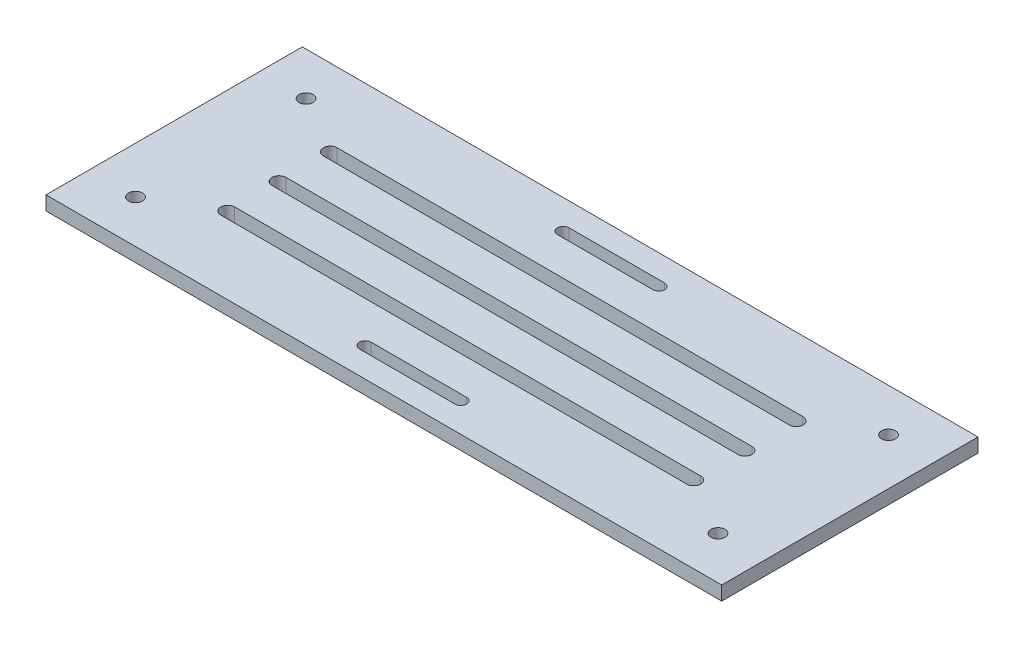
ISO-10303-21;
HEADER;
FILE_DESCRIPTION(('STEP AP214'),'2;1');
FILE_NAME('part.step','',(''),(''),'','','');
FILE_SCHEMA(('AUTOMOTIVE_DESIGN { 1 0 10303 214 1 1 1 1 }'));
ENDSEC;
DATA;
#1=APPLICATION_CONTEXT('core data for automotive mechanical design processes');
#2=APPLICATION_PROTOCOL_DEFINITION('international standard','automotive_design',2000,#1);
#3=PRODUCT_CONTEXT('',#1,'mechanical');
#4=PRODUCT('Part','Part','',(#3));
#5=PRODUCT_RELATED_PRODUCT_CATEGORY('part','',(#4));
#6=PRODUCT_DEFINITION_FORMATION('','',#4);
#7=PRODUCT_DEFINITION_CONTEXT('part definition',#1,'design');
#8=PRODUCT_DEFINITION('design','',#6,#7);
#9=PRODUCT_DEFINITION_SHAPE('','',#8);
#10=(LENGTH_UNIT() NAMED_UNIT(*) SI_UNIT(.MILLI.,.METRE.));
#11=(NAMED_UNIT(*) PLANE_ANGLE_UNIT() SI_UNIT($,.RADIAN.));
#12=(NAMED_UNIT(*) SI_UNIT($,.STERADIAN.) SOLID_ANGLE_UNIT());
#13=UNCERTAINTY_MEASURE_WITH_UNIT(LENGTH_MEASURE(1.E-05),#10,'distance_accuracy_value','');
#14=(GEOMETRIC_REPRESENTATION_CONTEXT(3) GLOBAL_UNCERTAINTY_ASSIGNED_CONTEXT((#13)) GLOBAL_UNIT_ASSIGNED_CONTEXT((#10,
#11,#12)) REPRESENTATION_CONTEXT('',''));
#15=CARTESIAN_POINT('',(0.,0.,0.));
#16=DIRECTION('',(0.,0.,1.));
#17=DIRECTION('',(1.,0.,0.));
#18=AXIS2_PLACEMENT_3D('',#15,#16,#17);
#19=CARTESIAN_POINT('',(72.5,3.,27.5));
#20=DIRECTION('',(-1.,0.,0.));
#21=DIRECTION('',(0.,0.,1.));
#22=AXIS2_PLACEMENT_3D('',#19,#20,#21);
#23=PLANE('',#22);
#24=DIRECTION('',(0.,0.,-1.));
#25=VECTOR('',#24,1.);
#26=CARTESIAN_POINT('',(72.5,0.,27.5));
#27=LINE('',#26,#25);
#28=CARTESIAN_POINT('',(72.5,0.,27.5));
#29=VERTEX_POINT('',#28);
#30=CARTESIAN_POINT('',(72.5,0.,-27.5));
#31=VERTEX_POINT('',#30);
#32=EDGE_CURVE('E383',#29,#31,#27,.T.);
#33=ORIENTED_EDGE('',*,*,#32,.T.);
#34=DIRECTION('',(0.,-1.,0.));
#35=VECTOR('',#34,1.);
#36=CARTESIAN_POINT('',(72.5,3.,-27.5));
#37=LINE('',#36,#35);
#38=CARTESIAN_POINT('',(72.5,3.,-27.5));
#39=VERTEX_POINT('',#38);
#40=EDGE_CURVE('E11',#39,#31,#37,.T.);
#41=ORIENTED_EDGE('',*,*,#40,.F.);
#42=DIRECTION('',(0.,0.,-1.));
#43=VECTOR('',#42,1.);
#44=CARTESIAN_POINT('',(72.5,3.,27.5));
#45=LINE('',#44,#43);
#46=CARTESIAN_POINT('',(72.5,3.,27.5));
#47=VERTEX_POINT('',#46);
#48=EDGE_CURVE('E390',#47,#39,#45,.T.);
#49=ORIENTED_EDGE('',*,*,#48,.F.);
#50=DIRECTION('',(0.,-1.,0.));
#51=VECTOR('',#50,1.);
#52=CARTESIAN_POINT('',(72.5,3.,27.5));
#53=LINE('',#52,#51);
#54=EDGE_CURVE('E400',#47,#29,#53,.T.);
#55=ORIENTED_EDGE('',*,*,#54,.T.);
#56=EDGE_LOOP('',(#33,#41,#49,#55));
#57=FACE_BOUND('',#56,.T.);
#58=ADVANCED_FACE('F39',(#57),#23,.F.);
#59=CARTESIAN_POINT('',(-72.5,3.,-27.5));
#60=DIRECTION('',(0.,0.,1.));
#61=DIRECTION('',(1.,0.,0.));
#62=AXIS2_PLACEMENT_3D('',#59,#60,#61);
#63=PLANE('',#62);
#64=DIRECTION('',(-1.,0.,0.));
#65=VECTOR('',#64,1.);
#66=CARTESIAN_POINT('',(-72.5,0.,-27.5));
#67=LINE('',#66,#65);
#68=CARTESIAN_POINT('',(-72.5,0.,-27.5));
#69=VERTEX_POINT('',#68);
#70=EDGE_CURVE('E397',#31,#69,#67,.T.);
#71=ORIENTED_EDGE('',*,*,#70,.T.);
#72=DIRECTION('',(0.,-1.,0.));
#73=VECTOR('',#72,1.);
#74=CARTESIAN_POINT('',(-72.5,3.,-27.5));
#75=LINE('',#74,#73);
#76=CARTESIAN_POINT('',(-72.5,3.,-27.5));
#77=VERTEX_POINT('',#76);
#78=EDGE_CURVE('E46',#77,#69,#75,.T.);
#79=ORIENTED_EDGE('',*,*,#78,.F.);
#80=DIRECTION('',(-1.,0.,0.));
#81=VECTOR('',#80,1.);
#82=CARTESIAN_POINT('',(-72.5,3.,-27.5));
#83=LINE('',#82,#81);
#84=EDGE_CURVE('E388',#39,#77,#83,.T.);
#85=ORIENTED_EDGE('',*,*,#84,.F.);
#86=ORIENTED_EDGE('',*,*,#40,.T.);
#87=EDGE_LOOP('',(#71,#79,#85,#86));
#88=FACE_BOUND('',#87,.T.);
#89=ADVANCED_FACE('F427',(#88),#63,.F.);
#90=CARTESIAN_POINT('',(-72.5,3.,27.5));
#91=DIRECTION('',(1.,0.,0.));
#92=DIRECTION('',(0.,0.,-1.));
#93=AXIS2_PLACEMENT_3D('',#90,#91,#92);
#94=PLANE('',#93);
#95=DIRECTION('',(0.,0.,1.));
#96=VECTOR('',#95,1.);
#97=CARTESIAN_POINT('',(-72.5,0.,27.5));
#98=LINE('',#97,#96);
#99=CARTESIAN_POINT('',(-72.5,0.,27.5));
#100=VERTEX_POINT('',#99);
#101=EDGE_CURVE('E405',#69,#100,#98,.T.);
#102=ORIENTED_EDGE('',*,*,#101,.T.);
#103=DIRECTION('',(0.,-1.,0.));
#104=VECTOR('',#103,1.);
#105=CARTESIAN_POINT('',(-72.5,3.,27.5));
#106=LINE('',#105,#104);
#107=CARTESIAN_POINT('',(-72.5,3.,27.5));
#108=VERTEX_POINT('',#107);
#109=EDGE_CURVE('E410',#108,#100,#106,.T.);
#110=ORIENTED_EDGE('',*,*,#109,.F.);
#111=DIRECTION('',(0.,0.,1.));
#112=VECTOR('',#111,1.);
#113=CARTESIAN_POINT('',(-72.5,3.,27.5));
#114=LINE('',#113,#112);
#115=EDGE_CURVE('E394',#77,#108,#114,.T.);
#116=ORIENTED_EDGE('',*,*,#115,.F.);
#117=ORIENTED_EDGE('',*,*,#78,.T.);
#118=EDGE_LOOP('',(#102,#110,#116,#117));
#119=FACE_BOUND('',#118,.T.);
#120=ADVANCED_FACE('F414',(#119),#94,.F.);
#121=CARTESIAN_POINT('',(-72.5,3.,27.5));
#122=DIRECTION('',(0.,0.,-1.));
#123=DIRECTION('',(-1.,0.,0.));
#124=AXIS2_PLACEMENT_3D('',#121,#122,#123);
#125=PLANE('',#124);
#126=DIRECTION('',(1.,0.,0.));
#127=VECTOR('',#126,1.);
#128=CARTESIAN_POINT('',(-72.5,0.,27.5));
#129=LINE('',#128,#127);
#130=EDGE_CURVE('E392',#100,#29,#129,.T.);
#131=ORIENTED_EDGE('',*,*,#130,.T.);
#132=ORIENTED_EDGE('',*,*,#54,.F.);
#133=DIRECTION('',(1.,0.,0.));
#134=VECTOR('',#133,1.);
#135=CARTESIAN_POINT('',(-72.5,3.,27.5));
#136=LINE('',#135,#134);
#137=EDGE_CURVE('E393',#108,#47,#136,.T.);
#138=ORIENTED_EDGE('',*,*,#137,.F.);
#139=ORIENTED_EDGE('',*,*,#109,.T.);
#140=EDGE_LOOP('',(#131,#132,#138,#139));
#141=FACE_BOUND('',#140,.T.);
#142=ADVANCED_FACE('F421',(#141),#125,.F.);
#143=CARTESIAN_POINT('',(0.,3.,0.));
#144=DIRECTION('',(0.,-1.,0.));
#145=DIRECTION('',(0.,0.,-1.));
#146=AXIS2_PLACEMENT_3D('',#143,#144,#145);
#147=PLANE('',#146);
#148=CARTESIAN_POINT('',(-62.5,3.,18.3));
#149=DIRECTION('',(0.,1.,0.));
#150=DIRECTION('',(0.,0.,-1.));
#151=AXIS2_PLACEMENT_3D('',#148,#149,#150);
#152=CIRCLE('',#151,1.5);
#153=CARTESIAN_POINT('',(-62.5,3.,16.8));
#154=VERTEX_POINT('',#153);
#155=EDGE_CURVE('E334',#154,#154,#152,.T.);
#156=ORIENTED_EDGE('',*,*,#155,.F.);
#157=EDGE_LOOP('',(#156));
#158=FACE_BOUND('',#157,.T.);
#159=CARTESIAN_POINT('',(62.5,3.,18.3000000000001));
#160=DIRECTION('',(0.,1.,0.));
#161=DIRECTION('',(0.,0.,1.));
#162=AXIS2_PLACEMENT_3D('',#159,#160,#161);
#163=CIRCLE('',#162,1.5);
#164=CARTESIAN_POINT('',(62.5,3.,19.8000000000001));
#165=VERTEX_POINT('',#164);
#166=EDGE_CURVE('E338',#165,#165,#163,.T.);
#167=ORIENTED_EDGE('',*,*,#166,.F.);
#168=EDGE_LOOP('',(#167));
#169=FACE_BOUND('',#168,.T.);
#170=CARTESIAN_POINT('',(62.5,3.,-18.2999999999999));
#171=DIRECTION('',(0.,1.,0.));
#172=DIRECTION('',(0.,0.,-1.));
#173=AXIS2_PLACEMENT_3D('',#170,#171,#172);
#174=CIRCLE('',#173,1.5);
#175=CARTESIAN_POINT('',(62.5,3.,-19.7999999999999));
#176=VERTEX_POINT('',#175);
#177=EDGE_CURVE('E347',#176,#176,#174,.T.);
#178=ORIENTED_EDGE('',*,*,#177,.F.);
#179=EDGE_LOOP('',(#178));
#180=FACE_BOUND('',#179,.T.);
#181=DIRECTION('',(1.,0.,0.));
#182=VECTOR('',#181,1.);
#183=CARTESIAN_POINT('',(-10.25,3.,-20.));
#184=LINE('',#183,#182);
#185=CARTESIAN_POINT('',(-10.25,3.,-20.));
#186=VERTEX_POINT('',#185);
#187=CARTESIAN_POINT('',(10.25,3.,-20.));
#188=VERTEX_POINT('',#187);
#189=EDGE_CURVE('E370',#186,#188,#184,.T.);
#190=ORIENTED_EDGE('',*,*,#189,.F.);
#191=CARTESIAN_POINT('',(-10.25,3.,-21.25));
#192=DIRECTION('',(0.,1.,0.));
#193=DIRECTION('',(0.,0.,1.));
#194=AXIS2_PLACEMENT_3D('',#191,#192,#193);
#195=CIRCLE('',#194,1.25);
#196=CARTESIAN_POINT('',(-10.25,3.,-22.5));
#197=VERTEX_POINT('',#196);
#198=EDGE_CURVE('E52',#197,#186,#195,.T.);
#199=ORIENTED_EDGE('',*,*,#198,.F.);
#200=DIRECTION('',(-1.,0.,0.));
#201=VECTOR('',#200,1.);
#202=CARTESIAN_POINT('',(-10.25,3.,-22.5));
#203=LINE('',#202,#201);
#204=CARTESIAN_POINT('',(10.25,3.,-22.5));
#205=VERTEX_POINT('',#204);
#206=EDGE_CURVE('E357',#205,#197,#203,.T.);
#207=ORIENTED_EDGE('',*,*,#206,.F.);
#208=CARTESIAN_POINT('',(10.25,3.,-21.25));
#209=DIRECTION('',(0.,1.,0.));
#210=DIRECTION('',(0.,0.,1.));
#211=AXIS2_PLACEMENT_3D('',#208,#209,#210);
#212=CIRCLE('',#211,1.25);
#213=EDGE_CURVE('E361',#188,#205,#212,.T.);
#214=ORIENTED_EDGE('',*,*,#213,.F.);
#215=EDGE_LOOP('',(#190,#199,#207,#214));
#216=FACE_BOUND('',#215,.T.);
#217=DIRECTION('',(1.,0.,0.));
#218=VECTOR('',#217,1.);
#219=CARTESIAN_POINT('',(-50.,3.,1.5));
#220=LINE('',#219,#218);
#221=CARTESIAN_POINT('',(-50.,3.,1.5));
#222=VERTEX_POINT('',#221);
#223=CARTESIAN_POINT('',(50.,3.,1.49999999999998));
#224=VERTEX_POINT('',#223);
#225=EDGE_CURVE('E260',#222,#224,#220,.T.);
#226=ORIENTED_EDGE('',*,*,#225,.F.);
#227=CARTESIAN_POINT('',(-50.,3.,0.));
#228=DIRECTION('',(0.,1.,0.));
#229=DIRECTION('',(0.,0.,1.));
#230=AXIS2_PLACEMENT_3D('',#227,#228,#229);
#231=CIRCLE('',#230,1.5);
#232=CARTESIAN_POINT('',(-50.,3.,-1.5));
#233=VERTEX_POINT('',#232);
#234=EDGE_CURVE('E62',#233,#222,#231,.T.);
#235=ORIENTED_EDGE('',*,*,#234,.F.);
#236=DIRECTION('',(-1.,0.,0.));
#237=VECTOR('',#236,1.);
#238=CARTESIAN_POINT('',(-50.,3.,-1.5));
#239=LINE('',#238,#237);
#240=CARTESIAN_POINT('',(50.,3.,-1.50000000000002));
#241=VERTEX_POINT('',#240);
#242=EDGE_CURVE('E247',#241,#233,#239,.T.);
#243=ORIENTED_EDGE('',*,*,#242,.F.);
#244=CARTESIAN_POINT('',(50.,3.,0.));
#245=DIRECTION('',(0.,1.,0.));
#246=DIRECTION('',(0.,0.,1.));
#247=AXIS2_PLACEMENT_3D('',#244,#245,#246);
#248=CIRCLE('',#247,1.5);
#249=EDGE_CURVE('E251',#224,#241,#248,.T.);
#250=ORIENTED_EDGE('',*,*,#249,.F.);
#251=EDGE_LOOP('',(#226,#235,#243,#250));
#252=FACE_BOUND('',#251,.T.);
#253=DIRECTION('',(1.,0.,0.));
#254=VECTOR('',#253,1.);
#255=CARTESIAN_POINT('',(-50.,3.,12.5));
#256=LINE('',#255,#254);
#257=CARTESIAN_POINT('',(-50.,3.,12.5));
#258=VERTEX_POINT('',#257);
#259=CARTESIAN_POINT('',(50.,3.,12.5));
#260=VERTEX_POINT('',#259);
#261=EDGE_CURVE('E224',#258,#260,#256,.T.);
#262=ORIENTED_EDGE('',*,*,#261,.F.);
#263=CARTESIAN_POINT('',(-50.,3.,11.));
#264=DIRECTION('',(0.,1.,0.));
#265=DIRECTION('',(0.,0.,-1.));
#266=AXIS2_PLACEMENT_3D('',#263,#264,#265);
#267=CIRCLE('',#266,1.5);
#268=CARTESIAN_POINT('',(-50.,3.,9.50000000000001));
#269=VERTEX_POINT('',#268);
#270=EDGE_CURVE('E205',#269,#258,#267,.T.);
#271=ORIENTED_EDGE('',*,*,#270,.F.);
#272=DIRECTION('',(-1.,0.,0.));
#273=VECTOR('',#272,1.);
#274=CARTESIAN_POINT('',(-50.,3.,9.50000000000001));
#275=LINE('',#274,#273);
#276=CARTESIAN_POINT('',(50.,3.,9.5));
#277=VERTEX_POINT('',#276);
#278=EDGE_CURVE('E215',#277,#269,#275,.T.);
#279=ORIENTED_EDGE('',*,*,#278,.F.);
#280=CARTESIAN_POINT('',(50.,3.,11.));
#281=DIRECTION('',(0.,1.,0.));
#282=DIRECTION('',(0.,0.,-1.));
#283=AXIS2_PLACEMENT_3D('',#280,#281,#282);
#284=CIRCLE('',#283,1.5);
#285=EDGE_CURVE('E220',#260,#277,#284,.T.);
#286=ORIENTED_EDGE('',*,*,#285,.F.);
#287=EDGE_LOOP('',(#262,#271,#279,#286));
#288=FACE_BOUND('',#287,.T.);
#289=DIRECTION('',(1.,0.,0.));
#290=VECTOR('',#289,1.);
#291=CARTESIAN_POINT('',(-10.25,3.,22.5));
#292=LINE('',#291,#290);
#293=CARTESIAN_POINT('',(-10.25,3.,22.5));
#294=VERTEX_POINT('',#293);
#295=CARTESIAN_POINT('',(10.25,3.,22.5));
#296=VERTEX_POINT('',#295);
#297=EDGE_CURVE('E317',#294,#296,#292,.T.);
#298=ORIENTED_EDGE('',*,*,#297,.F.);
#299=CARTESIAN_POINT('',(-10.25,3.,21.25));
#300=DIRECTION('',(0.,1.,0.));
#301=DIRECTION('',(0.,0.,-1.));
#302=AXIS2_PLACEMENT_3D('',#299,#300,#301);
#303=CIRCLE('',#302,1.25);
#304=CARTESIAN_POINT('',(-10.25,3.,20.));
#305=VERTEX_POINT('',#304);
#306=EDGE_CURVE('E282',#305,#294,#303,.T.);
#307=ORIENTED_EDGE('',*,*,#306,.F.);
#308=DIRECTION('',(-1.,0.,0.));
#309=VECTOR('',#308,1.);
#310=CARTESIAN_POINT('',(-10.25,3.,20.));
#311=LINE('',#310,#309);
#312=CARTESIAN_POINT('',(10.25,3.,20.));
#313=VERTEX_POINT('',#312);
#314=EDGE_CURVE('E315',#313,#305,#311,.T.);
#315=ORIENTED_EDGE('',*,*,#314,.F.);
#316=CARTESIAN_POINT('',(10.25,3.,21.25));
#317=DIRECTION('',(0.,1.,0.));
#318=DIRECTION('',(0.,0.,-1.));
#319=AXIS2_PLACEMENT_3D('',#316,#317,#318);
#320=CIRCLE('',#319,1.25);
#321=EDGE_CURVE('E312',#296,#313,#320,.T.);
#322=ORIENTED_EDGE('',*,*,#321,.F.);
#323=EDGE_LOOP('',(#298,#307,#315,#322));
#324=FACE_BOUND('',#323,.T.);
#325=DIRECTION('',(1.,0.,0.));
#326=VECTOR('',#325,1.);
#327=CARTESIAN_POINT('',(-50.,3.,-9.5));
#328=LINE('',#327,#326);
#329=CARTESIAN_POINT('',(-50.,3.,-9.5));
#330=VERTEX_POINT('',#329);
#331=CARTESIAN_POINT('',(50.,3.,-9.5));
#332=VERTEX_POINT('',#331);
#333=EDGE_CURVE('E289',#330,#332,#328,.T.);
#334=ORIENTED_EDGE('',*,*,#333,.F.);
#335=CARTESIAN_POINT('',(-50.,3.,-11.));
#336=DIRECTION('',(0.,1.,0.));
#337=DIRECTION('',(0.,0.,1.));
#338=AXIS2_PLACEMENT_3D('',#335,#336,#337);
#339=CIRCLE('',#338,1.5);
#340=CARTESIAN_POINT('',(-50.,3.,-12.5));
#341=VERTEX_POINT('',#340);
#342=EDGE_CURVE('E295',#341,#330,#339,.T.);
#343=ORIENTED_EDGE('',*,*,#342,.F.);
#344=DIRECTION('',(-1.,0.,0.));
#345=VECTOR('',#344,1.);
#346=CARTESIAN_POINT('',(-50.,3.,-12.5));
#347=LINE('',#346,#345);
#348=CARTESIAN_POINT('',(50.,3.,-12.5));
#349=VERTEX_POINT('',#348);
#350=EDGE_CURVE('E285',#349,#341,#347,.T.);
#351=ORIENTED_EDGE('',*,*,#350,.F.);
#352=CARTESIAN_POINT('',(50.,3.,-11.));
#353=DIRECTION('',(0.,1.,0.));
#354=DIRECTION('',(0.,0.,1.));
#355=AXIS2_PLACEMENT_3D('',#352,#353,#354);
#356=CIRCLE('',#355,1.5);
#357=EDGE_CURVE('E283',#332,#349,#356,.T.);
#358=ORIENTED_EDGE('',*,*,#357,.F.);
#359=EDGE_LOOP('',(#334,#343,#351,#358));
#360=FACE_BOUND('',#359,.T.);
#361=CARTESIAN_POINT('',(-62.5,3.,-18.3));
#362=DIRECTION('',(0.,1.,0.));
#363=DIRECTION('',(0.,0.,1.));
#364=AXIS2_PLACEMENT_3D('',#361,#362,#363);
#365=CIRCLE('',#364,1.5);
#366=CARTESIAN_POINT('',(-62.5,3.,-16.8));
#367=VERTEX_POINT('',#366);
#368=EDGE_CURVE('E337',#367,#367,#365,.T.);
#369=ORIENTED_EDGE('',*,*,#368,.F.);
#370=EDGE_LOOP('',(#369));
#371=FACE_BOUND('',#370,.T.);
#372=ORIENTED_EDGE('',*,*,#48,.T.);
#373=ORIENTED_EDGE('',*,*,#84,.T.);
#374=ORIENTED_EDGE('',*,*,#115,.T.);
#375=ORIENTED_EDGE('',*,*,#137,.T.);
#376=EDGE_LOOP('',(#372,#373,#374,#375));
#377=FACE_BOUND('',#376,.T.);
#378=ADVANCED_FACE('F219',(#158,#169,#180,#216,#252,#288,#324,#360,#371,#377),#147,.F.);
#379=CARTESIAN_POINT('',(0.,0.,0.));
#380=DIRECTION('',(0.,-1.,0.));
#381=DIRECTION('',(0.,0.,-1.));
#382=AXIS2_PLACEMENT_3D('',#379,#380,#381);
#383=PLANE('',#382);
#384=CARTESIAN_POINT('',(-62.5,0.,18.3));
#385=DIRECTION('',(0.,1.,0.));
#386=DIRECTION('',(0.,0.,-1.));
#387=AXIS2_PLACEMENT_3D('',#384,#385,#386);
#388=CIRCLE('',#387,1.5);
#389=CARTESIAN_POINT('',(-62.5,0.,16.8));
#390=VERTEX_POINT('',#389);
#391=EDGE_CURVE('E340',#390,#390,#388,.T.);
#392=ORIENTED_EDGE('',*,*,#391,.T.);
#393=EDGE_LOOP('',(#392));
#394=FACE_BOUND('',#393,.T.);
#395=CARTESIAN_POINT('',(62.5,0.,18.3000000000001));
#396=DIRECTION('',(0.,1.,0.));
#397=DIRECTION('',(0.,0.,1.));
#398=AXIS2_PLACEMENT_3D('',#395,#396,#397);
#399=CIRCLE('',#398,1.5);
#400=CARTESIAN_POINT('',(62.5,0.,19.8000000000001));
#401=VERTEX_POINT('',#400);
#402=EDGE_CURVE('E341',#401,#401,#399,.T.);
#403=ORIENTED_EDGE('',*,*,#402,.T.);
#404=EDGE_LOOP('',(#403));
#405=FACE_BOUND('',#404,.T.);
#406=CARTESIAN_POINT('',(62.5,0.,-18.2999999999999));
#407=DIRECTION('',(0.,1.,0.));
#408=DIRECTION('',(0.,0.,-1.));
#409=AXIS2_PLACEMENT_3D('',#406,#407,#408);
#410=CIRCLE('',#409,1.5);
#411=CARTESIAN_POINT('',(62.5,0.,-19.7999999999999));
#412=VERTEX_POINT('',#411);
#413=EDGE_CURVE('E349',#412,#412,#410,.T.);
#414=ORIENTED_EDGE('',*,*,#413,.T.);
#415=EDGE_LOOP('',(#414));
#416=FACE_BOUND('',#415,.T.);
#417=CARTESIAN_POINT('',(-10.25,0.,-21.25));
#418=DIRECTION('',(0.,1.,0.));
#419=DIRECTION('',(0.,0.,1.));
#420=AXIS2_PLACEMENT_3D('',#417,#418,#419);
#421=CIRCLE('',#420,1.25);
#422=CARTESIAN_POINT('',(-10.25,0.,-22.5));
#423=VERTEX_POINT('',#422);
#424=CARTESIAN_POINT('',(-10.25,0.,-20.));
#425=VERTEX_POINT('',#424);
#426=EDGE_CURVE('E365',#423,#425,#421,.T.);
#427=ORIENTED_EDGE('',*,*,#426,.T.);
#428=DIRECTION('',(1.,0.,0.));
#429=VECTOR('',#428,1.);
#430=CARTESIAN_POINT('',(-10.25,0.,-20.));
#431=LINE('',#430,#429);
#432=CARTESIAN_POINT('',(10.25,0.,-20.));
#433=VERTEX_POINT('',#432);
#434=EDGE_CURVE('E376',#425,#433,#431,.T.);
#435=ORIENTED_EDGE('',*,*,#434,.T.);
#436=CARTESIAN_POINT('',(10.25,0.,-21.25));
#437=DIRECTION('',(0.,1.,0.));
#438=DIRECTION('',(0.,0.,1.));
#439=AXIS2_PLACEMENT_3D('',#436,#437,#438);
#440=CIRCLE('',#439,1.25);
#441=CARTESIAN_POINT('',(10.25,0.,-22.5));
#442=VERTEX_POINT('',#441);
#443=EDGE_CURVE('E373',#433,#442,#440,.T.);
#444=ORIENTED_EDGE('',*,*,#443,.T.);
#445=DIRECTION('',(-1.,0.,0.));
#446=VECTOR('',#445,1.);
#447=CARTESIAN_POINT('',(-10.25,0.,-22.5));
#448=LINE('',#447,#446);
#449=EDGE_CURVE('E351',#442,#423,#448,.T.);
#450=ORIENTED_EDGE('',*,*,#449,.T.);
#451=EDGE_LOOP('',(#427,#435,#444,#450));
#452=FACE_BOUND('',#451,.T.);
#453=CARTESIAN_POINT('',(-50.,0.,0.));
#454=DIRECTION('',(0.,1.,0.));
#455=DIRECTION('',(0.,0.,1.));
#456=AXIS2_PLACEMENT_3D('',#453,#454,#455);
#457=CIRCLE('',#456,1.5);
#458=CARTESIAN_POINT('',(-50.,0.,-1.5));
#459=VERTEX_POINT('',#458);
#460=CARTESIAN_POINT('',(-50.,0.,1.5));
#461=VERTEX_POINT('',#460);
#462=EDGE_CURVE('E255',#459,#461,#457,.T.);
#463=ORIENTED_EDGE('',*,*,#462,.T.);
#464=DIRECTION('',(1.,0.,0.));
#465=VECTOR('',#464,1.);
#466=CARTESIAN_POINT('',(-50.,0.,1.5));
#467=LINE('',#466,#465);
#468=CARTESIAN_POINT('',(50.,0.,1.49999999999998));
#469=VERTEX_POINT('',#468);
#470=EDGE_CURVE('E266',#461,#469,#467,.T.);
#471=ORIENTED_EDGE('',*,*,#470,.T.);
#472=CARTESIAN_POINT('',(50.,0.,0.));
#473=DIRECTION('',(0.,1.,0.));
#474=DIRECTION('',(0.,0.,1.));
#475=AXIS2_PLACEMENT_3D('',#472,#473,#474);
#476=CIRCLE('',#475,1.5);
#477=CARTESIAN_POINT('',(50.,0.,-1.50000000000002));
#478=VERTEX_POINT('',#477);
#479=EDGE_CURVE('E263',#469,#478,#476,.T.);
#480=ORIENTED_EDGE('',*,*,#479,.T.);
#481=DIRECTION('',(-1.,0.,0.));
#482=VECTOR('',#481,1.);
#483=CARTESIAN_POINT('',(-50.,0.,-1.5));
#484=LINE('',#483,#482);
#485=EDGE_CURVE('E244',#478,#459,#484,.T.);
#486=ORIENTED_EDGE('',*,*,#485,.T.);
#487=EDGE_LOOP('',(#463,#471,#480,#486));
#488=FACE_BOUND('',#487,.T.);
#489=CARTESIAN_POINT('',(-50.,0.,11.));
#490=DIRECTION('',(0.,1.,0.));
#491=DIRECTION('',(0.,0.,-1.));
#492=AXIS2_PLACEMENT_3D('',#489,#490,#491);
#493=CIRCLE('',#492,1.5);
#494=CARTESIAN_POINT('',(-50.,0.,9.50000000000001));
#495=VERTEX_POINT('',#494);
#496=CARTESIAN_POINT('',(-50.,0.,12.5));
#497=VERTEX_POINT('',#496);
#498=EDGE_CURVE('E202',#495,#497,#493,.T.);
#499=ORIENTED_EDGE('',*,*,#498,.T.);
#500=DIRECTION('',(1.,0.,0.));
#501=VECTOR('',#500,1.);
#502=CARTESIAN_POINT('',(-50.,0.,12.5));
#503=LINE('',#502,#501);
#504=CARTESIAN_POINT('',(50.,0.,12.5));
#505=VERTEX_POINT('',#504);
#506=EDGE_CURVE('E240',#497,#505,#503,.T.);
#507=ORIENTED_EDGE('',*,*,#506,.T.);
#508=CARTESIAN_POINT('',(50.,0.,11.));
#509=DIRECTION('',(0.,1.,0.));
#510=DIRECTION('',(0.,0.,-1.));
#511=AXIS2_PLACEMENT_3D('',#508,#509,#510);
#512=CIRCLE('',#511,1.5);
#513=CARTESIAN_POINT('',(50.,0.,9.5));
#514=VERTEX_POINT('',#513);
#515=EDGE_CURVE('E231',#505,#514,#512,.T.);
#516=ORIENTED_EDGE('',*,*,#515,.T.);
#517=DIRECTION('',(-1.,0.,0.));
#518=VECTOR('',#517,1.);
#519=CARTESIAN_POINT('',(-50.,0.,9.50000000000001));
#520=LINE('',#519,#518);
#521=EDGE_CURVE('E233',#514,#495,#520,.T.);
#522=ORIENTED_EDGE('',*,*,#521,.T.);
#523=EDGE_LOOP('',(#499,#507,#516,#522));
#524=FACE_BOUND('',#523,.T.);
#525=CARTESIAN_POINT('',(-10.25,0.,21.25));
#526=DIRECTION('',(0.,1.,0.));
#527=DIRECTION('',(0.,0.,-1.));
#528=AXIS2_PLACEMENT_3D('',#525,#526,#527);
#529=CIRCLE('',#528,1.25);
#530=CARTESIAN_POINT('',(-10.25,0.,20.));
#531=VERTEX_POINT('',#530);
#532=CARTESIAN_POINT('',(-10.25,0.,22.5));
#533=VERTEX_POINT('',#532);
#534=EDGE_CURVE('E316',#531,#533,#529,.T.);
#535=ORIENTED_EDGE('',*,*,#534,.T.);
#536=DIRECTION('',(1.,0.,0.));
#537=VECTOR('',#536,1.);
#538=CARTESIAN_POINT('',(-10.25,0.,22.5));
#539=LINE('',#538,#537);
#540=CARTESIAN_POINT('',(10.25,0.,22.5));
#541=VERTEX_POINT('',#540);
#542=EDGE_CURVE('E327',#533,#541,#539,.T.);
#543=ORIENTED_EDGE('',*,*,#542,.T.);
#544=CARTESIAN_POINT('',(10.25,0.,21.25));
#545=DIRECTION('',(0.,1.,0.));
#546=DIRECTION('',(0.,0.,-1.));
#547=AXIS2_PLACEMENT_3D('',#544,#545,#546);
#548=CIRCLE('',#547,1.25);
#549=CARTESIAN_POINT('',(10.25,0.,20.));
#550=VERTEX_POINT('',#549);
#551=EDGE_CURVE('E324',#541,#550,#548,.T.);
#552=ORIENTED_EDGE('',*,*,#551,.T.);
#553=DIRECTION('',(-1.,0.,0.));
#554=VECTOR('',#553,1.);
#555=CARTESIAN_POINT('',(-10.25,0.,20.));
#556=LINE('',#555,#554);
#557=EDGE_CURVE('E306',#550,#531,#556,.T.);
#558=ORIENTED_EDGE('',*,*,#557,.T.);
#559=EDGE_LOOP('',(#535,#543,#552,#558));
#560=FACE_BOUND('',#559,.T.);
#561=CARTESIAN_POINT('',(-50.,0.,-11.));
#562=DIRECTION('',(0.,1.,0.));
#563=DIRECTION('',(0.,0.,1.));
#564=AXIS2_PLACEMENT_3D('',#561,#562,#563);
#565=CIRCLE('',#564,1.5);
#566=CARTESIAN_POINT('',(-50.,0.,-12.5));
#567=VERTEX_POINT('',#566);
#568=CARTESIAN_POINT('',(-50.,0.,-9.5));
#569=VERTEX_POINT('',#568);
#570=EDGE_CURVE('E288',#567,#569,#565,.T.);
#571=ORIENTED_EDGE('',*,*,#570,.T.);
#572=DIRECTION('',(1.,0.,0.));
#573=VECTOR('',#572,1.);
#574=CARTESIAN_POINT('',(-50.,0.,-9.5));
#575=LINE('',#574,#573);
#576=CARTESIAN_POINT('',(50.,0.,-9.5));
#577=VERTEX_POINT('',#576);
#578=EDGE_CURVE('E298',#569,#577,#575,.T.);
#579=ORIENTED_EDGE('',*,*,#578,.T.);
#580=CARTESIAN_POINT('',(50.,0.,-11.));
#581=DIRECTION('',(0.,1.,0.));
#582=DIRECTION('',(0.,0.,1.));
#583=AXIS2_PLACEMENT_3D('',#580,#581,#582);
#584=CIRCLE('',#583,1.5);
#585=CARTESIAN_POINT('',(50.,0.,-12.5));
#586=VERTEX_POINT('',#585);
#587=EDGE_CURVE('E300',#577,#586,#584,.T.);
#588=ORIENTED_EDGE('',*,*,#587,.T.);
#589=DIRECTION('',(-1.,0.,0.));
#590=VECTOR('',#589,1.);
#591=CARTESIAN_POINT('',(-50.,0.,-12.5));
#592=LINE('',#591,#590);
#593=EDGE_CURVE('E273',#586,#567,#592,.T.);
#594=ORIENTED_EDGE('',*,*,#593,.T.);
#595=EDGE_LOOP('',(#571,#579,#588,#594));
#596=FACE_BOUND('',#595,.T.);
#597=CARTESIAN_POINT('',(-62.5,0.,-18.3));
#598=DIRECTION('',(0.,1.,0.));
#599=DIRECTION('',(0.,0.,1.));
#600=AXIS2_PLACEMENT_3D('',#597,#598,#599);
#601=CIRCLE('',#600,1.5);
#602=CARTESIAN_POINT('',(-62.5,0.,-16.8));
#603=VERTEX_POINT('',#602);
#604=EDGE_CURVE('E381',#603,#603,#601,.T.);
#605=ORIENTED_EDGE('',*,*,#604,.T.);
#606=EDGE_LOOP('',(#605));
#607=FACE_BOUND('',#606,.T.);
#608=ORIENTED_EDGE('',*,*,#32,.F.);
#609=ORIENTED_EDGE('',*,*,#130,.F.);
#610=ORIENTED_EDGE('',*,*,#101,.F.);
#611=ORIENTED_EDGE('',*,*,#70,.F.);
#612=EDGE_LOOP('',(#608,#609,#610,#611));
#613=FACE_BOUND('',#612,.T.);
#614=ADVANCED_FACE('F419',(#394,#405,#416,#452,#488,#524,#560,#596,#607,#613),#383,.T.);
#615=CARTESIAN_POINT('',(-62.5,0.,-18.3));
#616=DIRECTION('',(0.,1.,0.));
#617=DIRECTION('',(0.,0.,1.));
#618=AXIS2_PLACEMENT_3D('',#615,#616,#617);
#619=CYLINDRICAL_SURFACE('',#618,1.5);
#620=ORIENTED_EDGE('',*,*,#604,.F.);
#621=EDGE_LOOP('',(#620));
#622=FACE_BOUND('',#621,.T.);
#623=ORIENTED_EDGE('',*,*,#368,.T.);
#624=EDGE_LOOP('',(#623));
#625=FACE_BOUND('',#624,.T.);
#626=ADVANCED_FACE('F442',(#622,#625),#619,.F.);
#627=CARTESIAN_POINT('',(-50.,0.,-11.));
#628=DIRECTION('',(0.,1.,0.));
#629=DIRECTION('',(0.,0.,1.));
#630=AXIS2_PLACEMENT_3D('',#627,#628,#629);
#631=CYLINDRICAL_SURFACE('',#630,1.5);
#632=ORIENTED_EDGE('',*,*,#342,.T.);
#633=DIRECTION('',(0.,1.,0.));
#634=VECTOR('',#633,1.);
#635=CARTESIAN_POINT('',(-50.,0.,-9.5));
#636=LINE('',#635,#634);
#637=EDGE_CURVE('E271',#569,#330,#636,.T.);
#638=ORIENTED_EDGE('',*,*,#637,.F.);
#639=ORIENTED_EDGE('',*,*,#570,.F.);
#640=DIRECTION('',(0.,1.,0.));
#641=VECTOR('',#640,1.);
#642=CARTESIAN_POINT('',(-50.,0.,-12.5));
#643=LINE('',#642,#641);
#644=EDGE_CURVE('E276',#567,#341,#643,.T.);
#645=ORIENTED_EDGE('',*,*,#644,.T.);
#646=EDGE_LOOP('',(#632,#638,#639,#645));
#647=FACE_BOUND('',#646,.T.);
#648=ADVANCED_FACE('F449',(#647),#631,.F.);
#649=CARTESIAN_POINT('',(-50.,0.,-12.5));
#650=DIRECTION('',(0.,0.,-1.));
#651=DIRECTION('',(-1.,0.,0.));
#652=AXIS2_PLACEMENT_3D('',#649,#650,#651);
#653=PLANE('',#652);
#654=ORIENTED_EDGE('',*,*,#350,.T.);
#655=ORIENTED_EDGE('',*,*,#644,.F.);
#656=ORIENTED_EDGE('',*,*,#593,.F.);
#657=DIRECTION('',(0.,1.,0.));
#658=VECTOR('',#657,1.);
#659=CARTESIAN_POINT('',(50.,0.,-12.5));
#660=LINE('',#659,#658);
#661=EDGE_CURVE('E280',#586,#349,#660,.T.);
#662=ORIENTED_EDGE('',*,*,#661,.T.);
#663=EDGE_LOOP('',(#654,#655,#656,#662));
#664=FACE_BOUND('',#663,.T.);
#665=ADVANCED_FACE('F494',(#664),#653,.F.);
#666=CARTESIAN_POINT('',(50.,0.,-11.));
#667=DIRECTION('',(0.,1.,0.));
#668=DIRECTION('',(0.,0.,1.));
#669=AXIS2_PLACEMENT_3D('',#666,#667,#668);
#670=CYLINDRICAL_SURFACE('',#669,1.5);
#671=ORIENTED_EDGE('',*,*,#357,.T.);
#672=ORIENTED_EDGE('',*,*,#661,.F.);
#673=ORIENTED_EDGE('',*,*,#587,.F.);
#674=DIRECTION('',(0.,1.,0.));
#675=VECTOR('',#674,1.);
#676=CARTESIAN_POINT('',(50.,0.,-9.5));
#677=LINE('',#676,#675);
#678=EDGE_CURVE('E274',#577,#332,#677,.T.);
#679=ORIENTED_EDGE('',*,*,#678,.T.);
#680=EDGE_LOOP('',(#671,#672,#673,#679));
#681=FACE_BOUND('',#680,.T.);
#682=ADVANCED_FACE('F499',(#681),#670,.F.);
#683=CARTESIAN_POINT('',(-50.,0.,-9.5));
#684=DIRECTION('',(0.,0.,1.));
#685=DIRECTION('',(1.,0.,0.));
#686=AXIS2_PLACEMENT_3D('',#683,#684,#685);
#687=PLANE('',#686);
#688=ORIENTED_EDGE('',*,*,#333,.T.);
#689=ORIENTED_EDGE('',*,*,#678,.F.);
#690=ORIENTED_EDGE('',*,*,#578,.F.);
#691=ORIENTED_EDGE('',*,*,#637,.T.);
#692=EDGE_LOOP('',(#688,#689,#690,#691));
#693=FACE_BOUND('',#692,.T.);
#694=ADVANCED_FACE('F492',(#693),#687,.F.);
#695=CARTESIAN_POINT('',(-10.25,0.,21.25));
#696=DIRECTION('',(0.,1.,0.));
#697=DIRECTION('',(0.,0.,1.));
#698=AXIS2_PLACEMENT_3D('',#695,#696,#697);
#699=CYLINDRICAL_SURFACE('',#698,1.25);
#700=ORIENTED_EDGE('',*,*,#306,.T.);
#701=DIRECTION('',(0.,1.,0.));
#702=VECTOR('',#701,1.);
#703=CARTESIAN_POINT('',(-10.25,0.,22.5));
#704=LINE('',#703,#702);
#705=EDGE_CURVE('E302',#533,#294,#704,.T.);
#706=ORIENTED_EDGE('',*,*,#705,.F.);
#707=ORIENTED_EDGE('',*,*,#534,.F.);
#708=DIRECTION('',(0.,1.,0.));
#709=VECTOR('',#708,1.);
#710=CARTESIAN_POINT('',(-10.25,0.,20.));
#711=LINE('',#710,#709);
#712=EDGE_CURVE('E221',#531,#305,#711,.T.);
#713=ORIENTED_EDGE('',*,*,#712,.T.);
#714=EDGE_LOOP('',(#700,#706,#707,#713));
#715=FACE_BOUND('',#714,.T.);
#716=ADVANCED_FACE('F485',(#715),#699,.F.);
#717=CARTESIAN_POINT('',(-10.25,0.,20.));
#718=DIRECTION('',(0.,0.,-1.));
#719=DIRECTION('',(-1.,0.,0.));
#720=AXIS2_PLACEMENT_3D('',#717,#718,#719);
#721=PLANE('',#720);
#722=ORIENTED_EDGE('',*,*,#314,.T.);
#723=ORIENTED_EDGE('',*,*,#712,.F.);
#724=ORIENTED_EDGE('',*,*,#557,.F.);
#725=DIRECTION('',(0.,1.,0.));
#726=VECTOR('',#725,1.);
#727=CARTESIAN_POINT('',(10.25,0.,20.));
#728=LINE('',#727,#726);
#729=EDGE_CURVE('E227',#550,#313,#728,.T.);
#730=ORIENTED_EDGE('',*,*,#729,.T.);
#731=EDGE_LOOP('',(#722,#723,#724,#730));
#732=FACE_BOUND('',#731,.T.);
#733=ADVANCED_FACE('F476',(#732),#721,.F.);
#734=CARTESIAN_POINT('',(10.25,0.,21.25));
#735=DIRECTION('',(0.,1.,0.));
#736=DIRECTION('',(0.,0.,1.));
#737=AXIS2_PLACEMENT_3D('',#734,#735,#736);
#738=CYLINDRICAL_SURFACE('',#737,1.25);
#739=ORIENTED_EDGE('',*,*,#321,.T.);
#740=ORIENTED_EDGE('',*,*,#729,.F.);
#741=ORIENTED_EDGE('',*,*,#551,.F.);
#742=DIRECTION('',(0.,1.,0.));
#743=VECTOR('',#742,1.);
#744=CARTESIAN_POINT('',(10.25,0.,22.5));
#745=LINE('',#744,#743);
#746=EDGE_CURVE('E310',#541,#296,#745,.T.);
#747=ORIENTED_EDGE('',*,*,#746,.T.);
#748=EDGE_LOOP('',(#739,#740,#741,#747));
#749=FACE_BOUND('',#748,.T.);
#750=ADVANCED_FACE('F481',(#749),#738,.F.);
#751=CARTESIAN_POINT('',(-10.25,0.,22.5));
#752=DIRECTION('',(0.,0.,1.));
#753=DIRECTION('',(1.,0.,0.));
#754=AXIS2_PLACEMENT_3D('',#751,#752,#753);
#755=PLANE('',#754);
#756=ORIENTED_EDGE('',*,*,#297,.T.);
#757=ORIENTED_EDGE('',*,*,#746,.F.);
#758=ORIENTED_EDGE('',*,*,#542,.F.);
#759=ORIENTED_EDGE('',*,*,#705,.T.);
#760=EDGE_LOOP('',(#756,#757,#758,#759));
#761=FACE_BOUND('',#760,.T.);
#762=ADVANCED_FACE('F486',(#761),#755,.F.);
#763=CARTESIAN_POINT('',(-50.,0.,11.));
#764=DIRECTION('',(0.,1.,0.));
#765=DIRECTION('',(0.,0.,1.));
#766=AXIS2_PLACEMENT_3D('',#763,#764,#765);
#767=CYLINDRICAL_SURFACE('',#766,1.5);
#768=ORIENTED_EDGE('',*,*,#270,.T.);
#769=DIRECTION('',(0.,1.,0.));
#770=VECTOR('',#769,1.);
#771=CARTESIAN_POINT('',(-50.,0.,12.5));
#772=LINE('',#771,#770);
#773=EDGE_CURVE('E234',#497,#258,#772,.T.);
#774=ORIENTED_EDGE('',*,*,#773,.F.);
#775=ORIENTED_EDGE('',*,*,#498,.F.);
#776=DIRECTION('',(0.,1.,0.));
#777=VECTOR('',#776,1.);
#778=CARTESIAN_POINT('',(-50.,0.,9.50000000000001));
#779=LINE('',#778,#777);
#780=EDGE_CURVE('E196',#495,#269,#779,.T.);
#781=ORIENTED_EDGE('',*,*,#780,.T.);
#782=EDGE_LOOP('',(#768,#774,#775,#781));
#783=FACE_BOUND('',#782,.T.);
#784=ADVANCED_FACE('F199',(#783),#767,.F.);
#785=CARTESIAN_POINT('',(-50.,0.,9.50000000000001));
#786=DIRECTION('',(0.,0.,-1.));
#787=DIRECTION('',(-1.,0.,0.));
#788=AXIS2_PLACEMENT_3D('',#785,#786,#787);
#789=PLANE('',#788);
#790=ORIENTED_EDGE('',*,*,#278,.T.);
#791=ORIENTED_EDGE('',*,*,#780,.F.);
#792=ORIENTED_EDGE('',*,*,#521,.F.);
#793=DIRECTION('',(0.,1.,0.));
#794=VECTOR('',#793,1.);
#795=CARTESIAN_POINT('',(50.,0.,9.5));
#796=LINE('',#795,#794);
#797=EDGE_CURVE('E207',#514,#277,#796,.T.);
#798=ORIENTED_EDGE('',*,*,#797,.T.);
#799=EDGE_LOOP('',(#790,#791,#792,#798));
#800=FACE_BOUND('',#799,.T.);
#801=ADVANCED_FACE('F213',(#800),#789,.F.);
#802=CARTESIAN_POINT('',(50.,0.,11.));
#803=DIRECTION('',(0.,1.,0.));
#804=DIRECTION('',(0.,0.,1.));
#805=AXIS2_PLACEMENT_3D('',#802,#803,#804);
#806=CYLINDRICAL_SURFACE('',#805,1.5);
#807=ORIENTED_EDGE('',*,*,#285,.T.);
#808=ORIENTED_EDGE('',*,*,#797,.F.);
#809=ORIENTED_EDGE('',*,*,#515,.F.);
#810=DIRECTION('',(0.,1.,0.));
#811=VECTOR('',#810,1.);
#812=CARTESIAN_POINT('',(50.,0.,12.5));
#813=LINE('',#812,#811);
#814=EDGE_CURVE('E713',#505,#260,#813,.T.);
#815=ORIENTED_EDGE('',*,*,#814,.T.);
#816=EDGE_LOOP('',(#807,#808,#809,#815));
#817=FACE_BOUND('',#816,.T.);
#818=ADVANCED_FACE('F528',(#817),#806,.F.);
#819=CARTESIAN_POINT('',(-50.,0.,12.5));
#820=DIRECTION('',(0.,0.,1.));
#821=DIRECTION('',(1.,0.,0.));
#822=AXIS2_PLACEMENT_3D('',#819,#820,#821);
#823=PLANE('',#822);
#824=ORIENTED_EDGE('',*,*,#261,.T.);
#825=ORIENTED_EDGE('',*,*,#814,.F.);
#826=ORIENTED_EDGE('',*,*,#506,.F.);
#827=ORIENTED_EDGE('',*,*,#773,.T.);
#828=EDGE_LOOP('',(#824,#825,#826,#827));
#829=FACE_BOUND('',#828,.T.);
#830=ADVANCED_FACE('F521',(#829),#823,.F.);
#831=CARTESIAN_POINT('',(-50.,0.,0.));
#832=DIRECTION('',(0.,1.,0.));
#833=DIRECTION('',(0.,0.,1.));
#834=AXIS2_PLACEMENT_3D('',#831,#832,#833);
#835=CYLINDRICAL_SURFACE('',#834,1.5);
#836=ORIENTED_EDGE('',*,*,#234,.T.);
#837=DIRECTION('',(0.,1.,0.));
#838=VECTOR('',#837,1.);
#839=CARTESIAN_POINT('',(-50.,0.,1.5));
#840=LINE('',#839,#838);
#841=EDGE_CURVE('E242',#461,#222,#840,.T.);
#842=ORIENTED_EDGE('',*,*,#841,.F.);
#843=ORIENTED_EDGE('',*,*,#462,.F.);
#844=DIRECTION('',(0.,1.,0.));
#845=VECTOR('',#844,1.);
#846=CARTESIAN_POINT('',(-50.,0.,-1.5));
#847=LINE('',#846,#845);
#848=EDGE_CURVE('E246',#459,#233,#847,.T.);
#849=ORIENTED_EDGE('',*,*,#848,.T.);
#850=EDGE_LOOP('',(#836,#842,#843,#849));
#851=FACE_BOUND('',#850,.T.);
#852=ADVANCED_FACE('F511',(#851),#835,.F.);
#853=CARTESIAN_POINT('',(-50.,0.,-1.5));
#854=DIRECTION('',(0.,0.,-1.));
#855=DIRECTION('',(-1.,0.,0.));
#856=AXIS2_PLACEMENT_3D('',#853,#854,#855);
#857=PLANE('',#856);
#858=ORIENTED_EDGE('',*,*,#242,.T.);
#859=ORIENTED_EDGE('',*,*,#848,.F.);
#860=ORIENTED_EDGE('',*,*,#485,.F.);
#861=DIRECTION('',(0.,1.,0.));
#862=VECTOR('',#861,1.);
#863=CARTESIAN_POINT('',(50.,0.,-1.50000000000002));
#864=LINE('',#863,#862);
#865=EDGE_CURVE('E248',#478,#241,#864,.T.);
#866=ORIENTED_EDGE('',*,*,#865,.T.);
#867=EDGE_LOOP('',(#858,#859,#860,#866));
#868=FACE_BOUND('',#867,.T.);
#869=ADVANCED_FACE('F509',(#868),#857,.F.);
#870=CARTESIAN_POINT('',(50.,0.,0.));
#871=DIRECTION('',(0.,1.,0.));
#872=DIRECTION('',(0.,0.,1.));
#873=AXIS2_PLACEMENT_3D('',#870,#871,#872);
#874=CYLINDRICAL_SURFACE('',#873,1.5);
#875=ORIENTED_EDGE('',*,*,#249,.T.);
#876=ORIENTED_EDGE('',*,*,#865,.F.);
#877=ORIENTED_EDGE('',*,*,#479,.F.);
#878=DIRECTION('',(0.,1.,0.));
#879=VECTOR('',#878,1.);
#880=CARTESIAN_POINT('',(50.,0.,1.49999999999998));
#881=LINE('',#880,#879);
#882=EDGE_CURVE('E241',#469,#224,#881,.T.);
#883=ORIENTED_EDGE('',*,*,#882,.T.);
#884=EDGE_LOOP('',(#875,#876,#877,#883));
#885=FACE_BOUND('',#884,.T.);
#886=ADVANCED_FACE('F515',(#885),#874,.F.);
#887=CARTESIAN_POINT('',(-50.,0.,1.5));
#888=DIRECTION('',(0.,0.,1.));
#889=DIRECTION('',(1.,0.,0.));
#890=AXIS2_PLACEMENT_3D('',#887,#888,#889);
#891=PLANE('',#890);
#892=ORIENTED_EDGE('',*,*,#225,.T.);
#893=ORIENTED_EDGE('',*,*,#882,.F.);
#894=ORIENTED_EDGE('',*,*,#470,.F.);
#895=ORIENTED_EDGE('',*,*,#841,.T.);
#896=EDGE_LOOP('',(#892,#893,#894,#895));
#897=FACE_BOUND('',#896,.T.);
#898=ADVANCED_FACE('F468',(#897),#891,.F.);
#899=CARTESIAN_POINT('',(-10.25,0.,-21.25));
#900=DIRECTION('',(0.,1.,0.));
#901=DIRECTION('',(0.,0.,1.));
#902=AXIS2_PLACEMENT_3D('',#899,#900,#901);
#903=CYLINDRICAL_SURFACE('',#902,1.25);
#904=ORIENTED_EDGE('',*,*,#198,.T.);
#905=DIRECTION('',(0.,1.,0.));
#906=VECTOR('',#905,1.);
#907=CARTESIAN_POINT('',(-10.25,0.,-20.));
#908=LINE('',#907,#906);
#909=EDGE_CURVE('E355',#425,#186,#908,.T.);
#910=ORIENTED_EDGE('',*,*,#909,.F.);
#911=ORIENTED_EDGE('',*,*,#426,.F.);
#912=DIRECTION('',(0.,1.,0.));
#913=VECTOR('',#912,1.);
#914=CARTESIAN_POINT('',(-10.25,0.,-22.5));
#915=LINE('',#914,#913);
#916=EDGE_CURVE('E294',#423,#197,#915,.T.);
#917=ORIENTED_EDGE('',*,*,#916,.T.);
#918=EDGE_LOOP('',(#904,#910,#911,#917));
#919=FACE_BOUND('',#918,.T.);
#920=ADVANCED_FACE('F454',(#919),#903,.F.);
#921=CARTESIAN_POINT('',(-10.25,0.,-22.5));
#922=DIRECTION('',(0.,0.,-1.));
#923=DIRECTION('',(-1.,0.,0.));
#924=AXIS2_PLACEMENT_3D('',#921,#922,#923);
#925=PLANE('',#924);
#926=ORIENTED_EDGE('',*,*,#206,.T.);
#927=ORIENTED_EDGE('',*,*,#916,.F.);
#928=ORIENTED_EDGE('',*,*,#449,.F.);
#929=DIRECTION('',(0.,1.,0.));
#930=VECTOR('',#929,1.);
#931=CARTESIAN_POINT('',(10.25,0.,-22.5));
#932=LINE('',#931,#930);
#933=EDGE_CURVE('E360',#442,#205,#932,.T.);
#934=ORIENTED_EDGE('',*,*,#933,.T.);
#935=EDGE_LOOP('',(#926,#927,#928,#934));
#936=FACE_BOUND('',#935,.T.);
#937=ADVANCED_FACE('F448',(#936),#925,.F.);
#938=CARTESIAN_POINT('',(10.25,0.,-21.25));
#939=DIRECTION('',(0.,1.,0.));
#940=DIRECTION('',(0.,0.,1.));
#941=AXIS2_PLACEMENT_3D('',#938,#939,#940);
#942=CYLINDRICAL_SURFACE('',#941,1.25);
#943=ORIENTED_EDGE('',*,*,#213,.T.);
#944=ORIENTED_EDGE('',*,*,#933,.F.);
#945=ORIENTED_EDGE('',*,*,#443,.F.);
#946=DIRECTION('',(0.,1.,0.));
#947=VECTOR('',#946,1.);
#948=CARTESIAN_POINT('',(10.25,0.,-20.));
#949=LINE('',#948,#947);
#950=EDGE_CURVE('E353',#433,#188,#949,.T.);
#951=ORIENTED_EDGE('',*,*,#950,.T.);
#952=EDGE_LOOP('',(#943,#944,#945,#951));
#953=FACE_BOUND('',#952,.T.);
#954=ADVANCED_FACE('F451',(#953),#942,.F.);
#955=CARTESIAN_POINT('',(-10.25,0.,-20.));
#956=DIRECTION('',(0.,0.,1.));
#957=DIRECTION('',(1.,0.,0.));
#958=AXIS2_PLACEMENT_3D('',#955,#956,#957);
#959=PLANE('',#958);
#960=ORIENTED_EDGE('',*,*,#189,.T.);
#961=ORIENTED_EDGE('',*,*,#950,.F.);
#962=ORIENTED_EDGE('',*,*,#434,.F.);
#963=ORIENTED_EDGE('',*,*,#909,.T.);
#964=EDGE_LOOP('',(#960,#961,#962,#963));
#965=FACE_BOUND('',#964,.T.);
#966=ADVANCED_FACE('F456',(#965),#959,.F.);
#967=CARTESIAN_POINT('',(62.5,0.,-18.2999999999999));
#968=DIRECTION('',(0.,1.,0.));
#969=DIRECTION('',(0.,0.,1.));
#970=AXIS2_PLACEMENT_3D('',#967,#968,#969);
#971=CYLINDRICAL_SURFACE('',#970,1.5);
#972=ORIENTED_EDGE('',*,*,#413,.F.);
#973=EDGE_LOOP('',(#972));
#974=FACE_BOUND('',#973,.T.);
#975=ORIENTED_EDGE('',*,*,#177,.T.);
#976=EDGE_LOOP('',(#975));
#977=FACE_BOUND('',#976,.T.);
#978=ADVANCED_FACE('F465',(#974,#977),#971,.F.);
#979=CARTESIAN_POINT('',(62.5,0.,18.3000000000001));
#980=DIRECTION('',(0.,1.,0.));
#981=DIRECTION('',(0.,0.,1.));
#982=AXIS2_PLACEMENT_3D('',#979,#980,#981);
#983=CYLINDRICAL_SURFACE('',#982,1.5);
#984=ORIENTED_EDGE('',*,*,#402,.F.);
#985=EDGE_LOOP('',(#984));
#986=FACE_BOUND('',#985,.T.);
#987=ORIENTED_EDGE('',*,*,#166,.T.);
#988=EDGE_LOOP('',(#987));
#989=FACE_BOUND('',#988,.T.);
#990=ADVANCED_FACE('F469',(#986,#989),#983,.F.);
#991=CARTESIAN_POINT('',(-62.5,0.,18.3));
#992=DIRECTION('',(0.,1.,0.));
#993=DIRECTION('',(0.,0.,1.));
#994=AXIS2_PLACEMENT_3D('',#991,#992,#993);
#995=CYLINDRICAL_SURFACE('',#994,1.5);
#996=ORIENTED_EDGE('',*,*,#391,.F.);
#997=EDGE_LOOP('',(#996));
#998=FACE_BOUND('',#997,.T.);
#999=ORIENTED_EDGE('',*,*,#155,.T.);
#1000=EDGE_LOOP('',(#999));
#1001=FACE_BOUND('',#1000,.T.);
#1002=ADVANCED_FACE('F471',(#998,#1001),#995,.F.);
#1003=CLOSED_SHELL('',(#58,#89,#120,#142,#378,#614,#626,#648,#665,#682,#694,#716,#733,#750,#762,
#784,#801,#818,#830,#852,#869,#886,#898,#920,#937,#954,#966,#978,#990,#1002));
#1004=MANIFOLD_SOLID_BREP('B2',#1003);
#1005=ADVANCED_BREP_SHAPE_REPRESENTATION('',(#18,#1004),#14);
#1006=SHAPE_DEFINITION_REPRESENTATION(#9,#1005);
ENDSEC;
END-ISO-10303-21;
